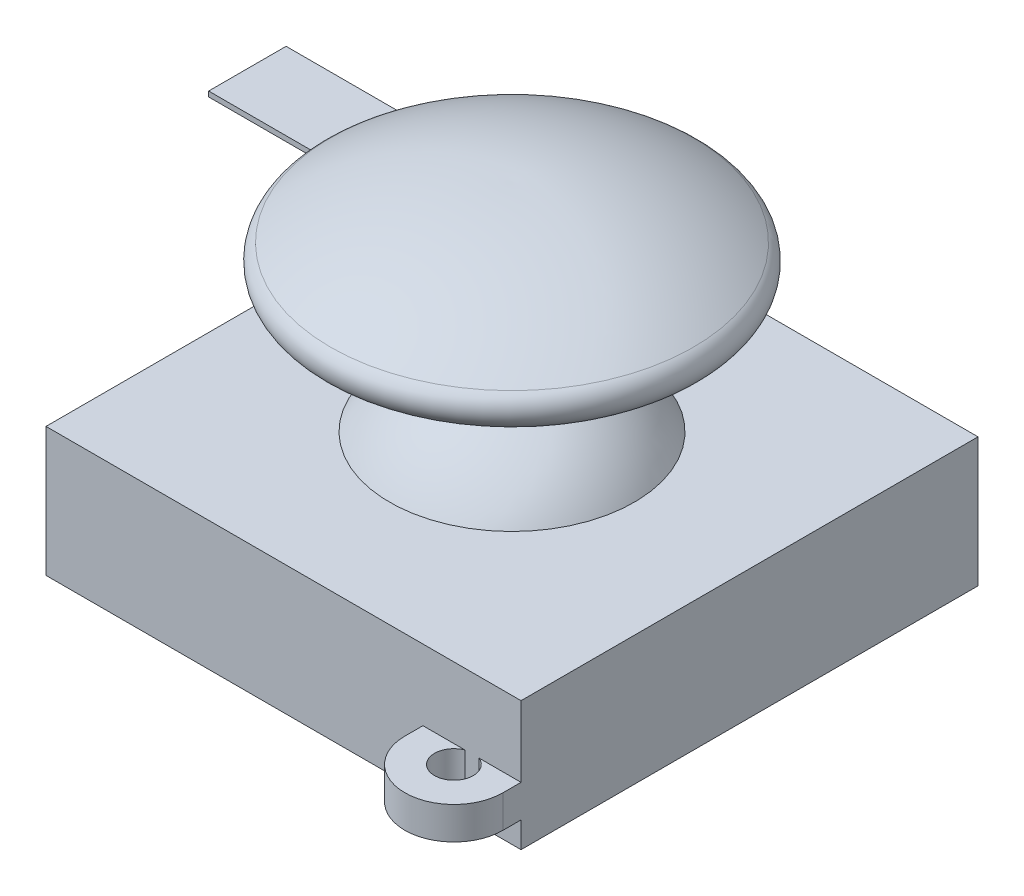
ISO-10303-21;
HEADER;
FILE_DESCRIPTION(('STEP AP214'),'2;1');
FILE_NAME('part.step','',(''),(''),'','','');
FILE_SCHEMA(('AUTOMOTIVE_DESIGN { 1 0 10303 214 1 1 1 1 }'));
ENDSEC;
DATA;
#1=APPLICATION_CONTEXT('core data for automotive mechanical design processes');
#2=APPLICATION_PROTOCOL_DEFINITION('international standard','automotive_design',2000,#1);
#3=PRODUCT_CONTEXT('',#1,'mechanical');
#4=PRODUCT('Part','Part','',(#3));
#5=PRODUCT_RELATED_PRODUCT_CATEGORY('part','',(#4));
#6=PRODUCT_DEFINITION_FORMATION('','',#4);
#7=PRODUCT_DEFINITION_CONTEXT('part definition',#1,'design');
#8=PRODUCT_DEFINITION('design','',#6,#7);
#9=PRODUCT_DEFINITION_SHAPE('','',#8);
#10=(LENGTH_UNIT() NAMED_UNIT(*) SI_UNIT(.MILLI.,.METRE.));
#11=(NAMED_UNIT(*) PLANE_ANGLE_UNIT() SI_UNIT($,.RADIAN.));
#12=(NAMED_UNIT(*) SI_UNIT($,.STERADIAN.) SOLID_ANGLE_UNIT());
#13=UNCERTAINTY_MEASURE_WITH_UNIT(LENGTH_MEASURE(1.E-05),#10,'distance_accuracy_value','');
#14=(GEOMETRIC_REPRESENTATION_CONTEXT(3) GLOBAL_UNCERTAINTY_ASSIGNED_CONTEXT((#13)) GLOBAL_UNIT_ASSIGNED_CONTEXT((#10,
#11,#12)) REPRESENTATION_CONTEXT('',''));
#15=CARTESIAN_POINT('',(0.,0.,0.));
#16=DIRECTION('',(0.,0.,1.));
#17=DIRECTION('',(1.,0.,0.));
#18=AXIS2_PLACEMENT_3D('',#15,#16,#17);
#19=CARTESIAN_POINT('',(-9.2,5.,8.85));
#20=DIRECTION('',(0.,0.,-1.));
#21=DIRECTION('',(-1.,0.,0.));
#22=AXIS2_PLACEMENT_3D('',#19,#20,#21);
#23=PLANE('',#22);
#24=DIRECTION('',(1.,0.,0.));
#25=VECTOR('',#24,1.);
#26=CARTESIAN_POINT('',(5.4,2.26,8.85));
#27=LINE('',#26,#25);
#28=CARTESIAN_POINT('',(5.4,2.26,8.85));
#29=VERTEX_POINT('',#28);
#30=CARTESIAN_POINT('',(7.03074175964328,2.26,8.85));
#31=VERTEX_POINT('',#30);
#32=EDGE_CURVE('E313',#29,#31,#27,.T.);
#33=ORIENTED_EDGE('',*,*,#32,.T.);
#34=DIRECTION('',(0.,-1.,0.));
#35=VECTOR('',#34,1.);
#36=CARTESIAN_POINT('',(7.03074175964328,2.26,8.85));
#37=LINE('',#36,#35);
#38=CARTESIAN_POINT('',(7.03074175964328,1.,8.85));
#39=VERTEX_POINT('',#38);
#40=EDGE_CURVE('E289',#31,#39,#37,.T.);
#41=ORIENTED_EDGE('',*,*,#40,.T.);
#42=DIRECTION('',(1.,0.,0.));
#43=VECTOR('',#42,1.);
#44=CARTESIAN_POINT('',(5.4,1.,8.85));
#45=LINE('',#44,#43);
#46=CARTESIAN_POINT('',(5.4,1.,8.85));
#47=VERTEX_POINT('',#46);
#48=EDGE_CURVE('E296',#47,#39,#45,.T.);
#49=ORIENTED_EDGE('',*,*,#48,.F.);
#50=DIRECTION('',(0.,-1.,0.));
#51=VECTOR('',#50,1.);
#52=CARTESIAN_POINT('',(5.4,2.26,8.85));
#53=LINE('',#52,#51);
#54=EDGE_CURVE('E286',#29,#47,#53,.T.);
#55=ORIENTED_EDGE('',*,*,#54,.F.);
#56=EDGE_LOOP('',(#33,#41,#49,#55));
#57=FACE_BOUND('',#56,.T.);
#58=DIRECTION('',(1.,0.,0.));
#59=VECTOR('',#58,1.);
#60=CARTESIAN_POINT('',(7.56925824035672,2.26,8.85));
#61=LINE('',#60,#59);
#62=CARTESIAN_POINT('',(7.56925824035672,2.26,8.85));
#63=VERTEX_POINT('',#62);
#64=CARTESIAN_POINT('',(9.2,2.26,8.85));
#65=VERTEX_POINT('',#64);
#66=EDGE_CURVE('E297',#63,#65,#61,.T.);
#67=ORIENTED_EDGE('',*,*,#66,.T.);
#68=DIRECTION('',(0.,-1.,0.));
#69=VECTOR('',#68,1.);
#70=CARTESIAN_POINT('',(9.2,5.,8.85));
#71=LINE('',#70,#69);
#72=CARTESIAN_POINT('',(9.2,5.,8.85));
#73=VERTEX_POINT('',#72);
#74=EDGE_CURVE('E382',#73,#65,#71,.T.);
#75=ORIENTED_EDGE('',*,*,#74,.F.);
#76=DIRECTION('',(1.,0.,0.));
#77=VECTOR('',#76,1.);
#78=CARTESIAN_POINT('',(-9.2,5.,8.85));
#79=LINE('',#78,#77);
#80=CARTESIAN_POINT('',(-9.2,5.,8.85));
#81=VERTEX_POINT('',#80);
#82=EDGE_CURVE('E370',#81,#73,#79,.T.);
#83=ORIENTED_EDGE('',*,*,#82,.F.);
#84=DIRECTION('',(0.,-1.,0.));
#85=VECTOR('',#84,1.);
#86=CARTESIAN_POINT('',(-9.2,5.,8.85));
#87=LINE('',#86,#85);
#88=CARTESIAN_POINT('',(-9.2,0.,8.85));
#89=VERTEX_POINT('',#88);
#90=EDGE_CURVE('E385',#81,#89,#87,.T.);
#91=ORIENTED_EDGE('',*,*,#90,.T.);
#92=DIRECTION('',(1.,0.,0.));
#93=VECTOR('',#92,1.);
#94=CARTESIAN_POINT('',(-9.2,0.,8.85));
#95=LINE('',#94,#93);
#96=CARTESIAN_POINT('',(9.2,0.,8.85));
#97=VERTEX_POINT('',#96);
#98=EDGE_CURVE('E366',#89,#97,#95,.T.);
#99=ORIENTED_EDGE('',*,*,#98,.T.);
#100=CARTESIAN_POINT('',(9.2,1.,8.85));
#101=VERTEX_POINT('',#100);
#102=EDGE_CURVE('E372',#101,#97,#71,.T.);
#103=ORIENTED_EDGE('',*,*,#102,.F.);
#104=DIRECTION('',(1.,0.,0.));
#105=VECTOR('',#104,1.);
#106=CARTESIAN_POINT('',(7.56925824035672,1.,8.85));
#107=LINE('',#106,#105);
#108=CARTESIAN_POINT('',(7.56925824035671,1.,8.85));
#109=VERTEX_POINT('',#108);
#110=EDGE_CURVE('E307',#109,#101,#107,.T.);
#111=ORIENTED_EDGE('',*,*,#110,.F.);
#112=DIRECTION('',(0.,-1.,0.));
#113=VECTOR('',#112,1.);
#114=CARTESIAN_POINT('',(7.56925824035672,2.26,8.85));
#115=LINE('',#114,#113);
#116=EDGE_CURVE('E279',#63,#109,#115,.T.);
#117=ORIENTED_EDGE('',*,*,#116,.F.);
#118=EDGE_LOOP('',(#67,#75,#83,#91,#99,#103,#111,#117));
#119=FACE_BOUND('',#118,.T.);
#120=ADVANCED_FACE('F45',(#57,#119),#23,.F.);
#121=CARTESIAN_POINT('',(-9.2,5.,8.85));
#122=DIRECTION('',(1.,0.,0.));
#123=DIRECTION('',(0.,0.,-1.));
#124=AXIS2_PLACEMENT_3D('',#121,#122,#123);
#125=PLANE('',#124);
#126=DIRECTION('',(0.,0.,1.));
#127=VECTOR('',#126,1.);
#128=CARTESIAN_POINT('',(-9.2,1.,-5.05));
#129=LINE('',#128,#127);
#130=CARTESIAN_POINT('',(-9.2,1.,-8.85));
#131=VERTEX_POINT('',#130);
#132=CARTESIAN_POINT('',(-9.2,1.,-5.05));
#133=VERTEX_POINT('',#132);
#134=EDGE_CURVE('E330',#131,#133,#129,.T.);
#135=ORIENTED_EDGE('',*,*,#134,.F.);
#136=DIRECTION('',(0.,-1.,0.));
#137=VECTOR('',#136,1.);
#138=CARTESIAN_POINT('',(-9.2,5.,-8.85));
#139=LINE('',#138,#137);
#140=CARTESIAN_POINT('',(-9.2,0.4,-8.85));
#141=VERTEX_POINT('',#140);
#142=EDGE_CURVE('E222',#131,#141,#139,.T.);
#143=ORIENTED_EDGE('',*,*,#142,.T.);
#144=DIRECTION('',(0.,0.,-1.));
#145=VECTOR('',#144,1.);
#146=CARTESIAN_POINT('',(-9.2,0.4,-8.85));
#147=LINE('',#146,#145);
#148=CARTESIAN_POINT('',(-9.2,0.4,-9.20749388800349));
#149=VERTEX_POINT('',#148);
#150=EDGE_CURVE('E213',#141,#149,#147,.T.);
#151=ORIENTED_EDGE('',*,*,#150,.T.);
#152=DIRECTION('',(0.,-1.,0.));
#153=VECTOR('',#152,1.);
#154=CARTESIAN_POINT('',(-9.2,0.4,-9.20749388800349));
#155=LINE('',#154,#153);
#156=CARTESIAN_POINT('',(-9.2,0.2,-9.20749388800349));
#157=VERTEX_POINT('',#156);
#158=EDGE_CURVE('E196',#149,#157,#155,.T.);
#159=ORIENTED_EDGE('',*,*,#158,.T.);
#160=DIRECTION('',(0.,0.,-1.));
#161=VECTOR('',#160,1.);
#162=CARTESIAN_POINT('',(-9.2,0.2,-8.85));
#163=LINE('',#162,#161);
#164=CARTESIAN_POINT('',(-9.2,0.2,-8.85));
#165=VERTEX_POINT('',#164);
#166=EDGE_CURVE('E241',#165,#157,#163,.T.);
#167=ORIENTED_EDGE('',*,*,#166,.F.);
#168=CARTESIAN_POINT('',(-9.2,0.,-8.85));
#169=VERTEX_POINT('',#168);
#170=EDGE_CURVE('E387',#165,#169,#139,.T.);
#171=ORIENTED_EDGE('',*,*,#170,.T.);
#172=DIRECTION('',(0.,0.,1.));
#173=VECTOR('',#172,1.);
#174=CARTESIAN_POINT('',(-9.2,0.,8.85));
#175=LINE('',#174,#173);
#176=EDGE_CURVE('E378',#169,#89,#175,.T.);
#177=ORIENTED_EDGE('',*,*,#176,.T.);
#178=ORIENTED_EDGE('',*,*,#90,.F.);
#179=DIRECTION('',(0.,0.,1.));
#180=VECTOR('',#179,1.);
#181=CARTESIAN_POINT('',(-9.2,5.,8.85));
#182=LINE('',#181,#180);
#183=CARTESIAN_POINT('',(-9.2,5.,-8.85));
#184=VERTEX_POINT('',#183);
#185=EDGE_CURVE('E368',#184,#81,#182,.T.);
#186=ORIENTED_EDGE('',*,*,#185,.F.);
#187=CARTESIAN_POINT('',(-9.2,2.26,-8.85));
#188=VERTEX_POINT('',#187);
#189=EDGE_CURVE('E388',#184,#188,#139,.T.);
#190=ORIENTED_EDGE('',*,*,#189,.T.);
#191=DIRECTION('',(0.,0.,1.));
#192=VECTOR('',#191,1.);
#193=CARTESIAN_POINT('',(-9.2,2.26,-5.05));
#194=LINE('',#193,#192);
#195=CARTESIAN_POINT('',(-9.2,2.26,-5.05));
#196=VERTEX_POINT('',#195);
#197=EDGE_CURVE('E333',#188,#196,#194,.T.);
#198=ORIENTED_EDGE('',*,*,#197,.T.);
#199=DIRECTION('',(0.,-1.,0.));
#200=VECTOR('',#199,1.);
#201=CARTESIAN_POINT('',(-9.2,2.26,-5.05));
#202=LINE('',#201,#200);
#203=EDGE_CURVE('E346',#196,#133,#202,.T.);
#204=ORIENTED_EDGE('',*,*,#203,.T.);
#205=EDGE_LOOP('',(#135,#143,#151,#159,#167,#171,#177,#178,#186,#190,#198,#204));
#206=FACE_BOUND('',#205,.T.);
#207=ADVANCED_FACE('F220',(#206),#125,.F.);
#208=CARTESIAN_POINT('',(9.2,5.,8.85));
#209=DIRECTION('',(-1.,0.,0.));
#210=DIRECTION('',(0.,0.,1.));
#211=AXIS2_PLACEMENT_3D('',#208,#209,#210);
#212=PLANE('',#211);
#213=DIRECTION('',(0.,0.,-1.));
#214=VECTOR('',#213,1.);
#215=CARTESIAN_POINT('',(9.2,0.,8.85));
#216=LINE('',#215,#214);
#217=CARTESIAN_POINT('',(9.2,0.,-8.85));
#218=VERTEX_POINT('',#217);
#219=EDGE_CURVE('E357',#97,#218,#216,.T.);
#220=ORIENTED_EDGE('',*,*,#219,.T.);
#221=DIRECTION('',(0.,-1.,0.));
#222=VECTOR('',#221,1.);
#223=CARTESIAN_POINT('',(9.2,5.,-8.85));
#224=LINE('',#223,#222);
#225=CARTESIAN_POINT('',(9.2,5.,-8.85));
#226=VERTEX_POINT('',#225);
#227=EDGE_CURVE('E49',#226,#218,#224,.T.);
#228=ORIENTED_EDGE('',*,*,#227,.F.);
#229=DIRECTION('',(0.,0.,-1.));
#230=VECTOR('',#229,1.);
#231=CARTESIAN_POINT('',(9.2,5.,8.85));
#232=LINE('',#231,#230);
#233=EDGE_CURVE('E362',#73,#226,#232,.T.);
#234=ORIENTED_EDGE('',*,*,#233,.F.);
#235=ORIENTED_EDGE('',*,*,#74,.T.);
#236=DIRECTION('',(0.,0.,1.));
#237=VECTOR('',#236,1.);
#238=CARTESIAN_POINT('',(9.2,2.26,8.85));
#239=LINE('',#238,#237);
#240=CARTESIAN_POINT('',(9.2,2.26,9.55));
#241=VERTEX_POINT('',#240);
#242=EDGE_CURVE('E322',#65,#241,#239,.T.);
#243=ORIENTED_EDGE('',*,*,#242,.T.);
#244=DIRECTION('',(0.,-1.,0.));
#245=VECTOR('',#244,1.);
#246=CARTESIAN_POINT('',(9.2,2.26,9.55));
#247=LINE('',#246,#245);
#248=CARTESIAN_POINT('',(9.2,1.,9.55));
#249=VERTEX_POINT('',#248);
#250=EDGE_CURVE('E281',#241,#249,#247,.T.);
#251=ORIENTED_EDGE('',*,*,#250,.T.);
#252=DIRECTION('',(0.,0.,1.));
#253=VECTOR('',#252,1.);
#254=CARTESIAN_POINT('',(9.2,1.,8.85));
#255=LINE('',#254,#253);
#256=EDGE_CURVE('E304',#101,#249,#255,.T.);
#257=ORIENTED_EDGE('',*,*,#256,.F.);
#258=ORIENTED_EDGE('',*,*,#102,.T.);
#259=EDGE_LOOP('',(#220,#228,#234,#235,#243,#251,#257,#258));
#260=FACE_BOUND('',#259,.T.);
#261=ADVANCED_FACE('F47',(#260),#212,.F.);
#262=CARTESIAN_POINT('',(-9.2,5.,-8.85));
#263=DIRECTION('',(0.,0.,1.));
#264=DIRECTION('',(1.,0.,0.));
#265=AXIS2_PLACEMENT_3D('',#262,#263,#264);
#266=PLANE('',#265);
#267=DIRECTION('',(0.,-1.,0.));
#268=VECTOR('',#267,1.);
#269=CARTESIAN_POINT('',(-6.2,0.4,-8.85));
#270=LINE('',#269,#268);
#271=CARTESIAN_POINT('',(-6.2,0.4,-8.85));
#272=VERTEX_POINT('',#271);
#273=CARTESIAN_POINT('',(-6.2,0.2,-8.85));
#274=VERTEX_POINT('',#273);
#275=EDGE_CURVE('E61',#272,#274,#270,.T.);
#276=ORIENTED_EDGE('',*,*,#275,.F.);
#277=DIRECTION('',(-1.,0.,0.));
#278=VECTOR('',#277,1.);
#279=CARTESIAN_POINT('',(-6.2,0.4,-8.85));
#280=LINE('',#279,#278);
#281=EDGE_CURVE('E223',#272,#141,#280,.T.);
#282=ORIENTED_EDGE('',*,*,#281,.T.);
#283=ORIENTED_EDGE('',*,*,#142,.F.);
#284=DIRECTION('',(1.,0.,0.));
#285=VECTOR('',#284,1.);
#286=CARTESIAN_POINT('',(-9.2,1.,-8.85));
#287=LINE('',#286,#285);
#288=CARTESIAN_POINT('',(-10.9,1.,-8.85));
#289=VERTEX_POINT('',#288);
#290=EDGE_CURVE('E337',#289,#131,#287,.T.);
#291=ORIENTED_EDGE('',*,*,#290,.F.);
#292=DIRECTION('',(0.,-1.,0.));
#293=VECTOR('',#292,1.);
#294=CARTESIAN_POINT('',(-10.9,2.26,-8.85));
#295=LINE('',#294,#293);
#296=CARTESIAN_POINT('',(-10.9,2.26,-8.85));
#297=VERTEX_POINT('',#296);
#298=EDGE_CURVE('E355',#297,#289,#295,.T.);
#299=ORIENTED_EDGE('',*,*,#298,.F.);
#300=DIRECTION('',(1.,0.,0.));
#301=VECTOR('',#300,1.);
#302=CARTESIAN_POINT('',(-9.2,2.26,-8.85));
#303=LINE('',#302,#301);
#304=EDGE_CURVE('E343',#297,#188,#303,.T.);
#305=ORIENTED_EDGE('',*,*,#304,.T.);
#306=ORIENTED_EDGE('',*,*,#189,.F.);
#307=DIRECTION('',(-1.,0.,0.));
#308=VECTOR('',#307,1.);
#309=CARTESIAN_POINT('',(-9.2,5.,-8.85));
#310=LINE('',#309,#308);
#311=EDGE_CURVE('E365',#226,#184,#310,.T.);
#312=ORIENTED_EDGE('',*,*,#311,.F.);
#313=ORIENTED_EDGE('',*,*,#227,.T.);
#314=DIRECTION('',(-1.,0.,0.));
#315=VECTOR('',#314,1.);
#316=CARTESIAN_POINT('',(-9.2,0.,-8.85));
#317=LINE('',#316,#315);
#318=EDGE_CURVE('E375',#218,#169,#317,.T.);
#319=ORIENTED_EDGE('',*,*,#318,.T.);
#320=ORIENTED_EDGE('',*,*,#170,.F.);
#321=DIRECTION('',(-1.,0.,0.));
#322=VECTOR('',#321,1.);
#323=CARTESIAN_POINT('',(-6.2,0.2,-8.85));
#324=LINE('',#323,#322);
#325=EDGE_CURVE('E66',#274,#165,#324,.T.);
#326=ORIENTED_EDGE('',*,*,#325,.F.);
#327=EDGE_LOOP('',(#276,#282,#283,#291,#299,#305,#306,#312,#313,#319,#320,#326));
#328=FACE_BOUND('',#327,.T.);
#329=ADVANCED_FACE('F395',(#328),#266,.F.);
#330=CARTESIAN_POINT('',(0.,5.,0.));
#331=DIRECTION('',(0.,-1.,0.));
#332=DIRECTION('',(0.,0.,-1.));
#333=AXIS2_PLACEMENT_3D('',#330,#331,#332);
#334=PLANE('',#333);
#335=CARTESIAN_POINT('',(0.,5.,0.));
#336=DIRECTION('',(0.,1.,0.));
#337=DIRECTION('',(0.,0.,1.));
#338=AXIS2_PLACEMENT_3D('',#335,#336,#337);
#339=CIRCLE('',#338,4.74);
#340=CARTESIAN_POINT('',(0.,5.,-4.74));
#341=VERTEX_POINT('',#340);
#342=EDGE_CURVE('E11',#341,#341,#339,.T.);
#343=ORIENTED_EDGE('',*,*,#342,.F.);
#344=EDGE_LOOP('',(#343));
#345=FACE_BOUND('',#344,.T.);
#346=ORIENTED_EDGE('',*,*,#233,.T.);
#347=ORIENTED_EDGE('',*,*,#311,.T.);
#348=ORIENTED_EDGE('',*,*,#185,.T.);
#349=ORIENTED_EDGE('',*,*,#82,.T.);
#350=EDGE_LOOP('',(#346,#347,#348,#349));
#351=FACE_BOUND('',#350,.T.);
#352=ADVANCED_FACE('F407',(#345,#351),#334,.F.);
#353=CARTESIAN_POINT('',(0.,0.,0.));
#354=DIRECTION('',(0.,-1.,0.));
#355=DIRECTION('',(0.,0.,-1.));
#356=AXIS2_PLACEMENT_3D('',#353,#354,#355);
#357=PLANE('',#356);
#358=ORIENTED_EDGE('',*,*,#219,.F.);
#359=ORIENTED_EDGE('',*,*,#98,.F.);
#360=ORIENTED_EDGE('',*,*,#176,.F.);
#361=ORIENTED_EDGE('',*,*,#318,.F.);
#362=EDGE_LOOP('',(#358,#359,#360,#361));
#363=FACE_BOUND('',#362,.T.);
#364=ADVANCED_FACE('F400',(#363),#357,.T.);
#365=CARTESIAN_POINT('',(-10.9,2.26,-6.95));
#366=DIRECTION('',(0.,-1.,0.));
#367=DIRECTION('',(0.,0.,-1.));
#368=AXIS2_PLACEMENT_3D('',#365,#366,#367);
#369=CYLINDRICAL_SURFACE('',#368,1.9);
#370=CARTESIAN_POINT('',(-10.9,1.,-6.95));
#371=DIRECTION('',(0.,-1.,0.));
#372=DIRECTION('',(0.,0.,1.));
#373=AXIS2_PLACEMENT_3D('',#370,#371,#372);
#374=CIRCLE('',#373,1.9);
#375=CARTESIAN_POINT('',(-10.9,1.,-5.05));
#376=VERTEX_POINT('',#375);
#377=EDGE_CURVE('E351',#376,#289,#374,.T.);
#378=ORIENTED_EDGE('',*,*,#377,.F.);
#379=DIRECTION('',(0.,-1.,0.));
#380=VECTOR('',#379,1.);
#381=CARTESIAN_POINT('',(-10.9,2.26,-5.05));
#382=LINE('',#381,#380);
#383=CARTESIAN_POINT('',(-10.9,2.26,-5.05));
#384=VERTEX_POINT('',#383);
#385=EDGE_CURVE('E358',#384,#376,#382,.T.);
#386=ORIENTED_EDGE('',*,*,#385,.F.);
#387=CARTESIAN_POINT('',(-10.9,2.26,-6.95));
#388=DIRECTION('',(0.,-1.,0.));
#389=DIRECTION('',(0.,0.,1.));
#390=AXIS2_PLACEMENT_3D('',#387,#388,#389);
#391=CIRCLE('',#390,1.9);
#392=EDGE_CURVE('E340',#384,#297,#391,.T.);
#393=ORIENTED_EDGE('',*,*,#392,.T.);
#394=ORIENTED_EDGE('',*,*,#298,.T.);
#395=EDGE_LOOP('',(#378,#386,#393,#394));
#396=FACE_BOUND('',#395,.T.);
#397=ADVANCED_FACE('F514',(#396),#369,.T.);
#398=CARTESIAN_POINT('',(-10.9,2.26,-5.05));
#399=DIRECTION('',(0.,0.,1.));
#400=DIRECTION('',(1.,0.,0.));
#401=AXIS2_PLACEMENT_3D('',#398,#399,#400);
#402=PLANE('',#401);
#403=DIRECTION('',(-1.,0.,0.));
#404=VECTOR('',#403,1.);
#405=CARTESIAN_POINT('',(-10.9,1.,-5.05));
#406=LINE('',#405,#404);
#407=EDGE_CURVE('E348',#133,#376,#406,.T.);
#408=ORIENTED_EDGE('',*,*,#407,.F.);
#409=ORIENTED_EDGE('',*,*,#203,.F.);
#410=DIRECTION('',(-1.,0.,0.));
#411=VECTOR('',#410,1.);
#412=CARTESIAN_POINT('',(-10.9,2.26,-5.05));
#413=LINE('',#412,#411);
#414=EDGE_CURVE('E336',#196,#384,#413,.T.);
#415=ORIENTED_EDGE('',*,*,#414,.T.);
#416=ORIENTED_EDGE('',*,*,#385,.T.);
#417=EDGE_LOOP('',(#408,#409,#415,#416));
#418=FACE_BOUND('',#417,.T.);
#419=ADVANCED_FACE('F417',(#418),#402,.T.);
#420=CARTESIAN_POINT('',(-10.9,2.26,-6.95));
#421=DIRECTION('',(0.,1.,0.));
#422=DIRECTION('',(0.,0.,1.));
#423=AXIS2_PLACEMENT_3D('',#420,#421,#422);
#424=PLANE('',#423);
#425=CARTESIAN_POINT('',(-10.9,2.26,-6.95));
#426=DIRECTION('',(0.,-1.,0.));
#427=DIRECTION('',(0.,0.,-1.));
#428=AXIS2_PLACEMENT_3D('',#425,#426,#427);
#429=CIRCLE('',#428,0.9);
#430=CARTESIAN_POINT('',(-10.9,2.26,-7.85));
#431=VERTEX_POINT('',#430);
#432=EDGE_CURVE('E327',#431,#431,#429,.T.);
#433=ORIENTED_EDGE('',*,*,#432,.T.);
#434=EDGE_LOOP('',(#433));
#435=FACE_BOUND('',#434,.T.);
#436=ORIENTED_EDGE('',*,*,#197,.F.);
#437=ORIENTED_EDGE('',*,*,#304,.F.);
#438=ORIENTED_EDGE('',*,*,#392,.F.);
#439=ORIENTED_EDGE('',*,*,#414,.F.);
#440=EDGE_LOOP('',(#436,#437,#438,#439));
#441=FACE_BOUND('',#440,.T.);
#442=ADVANCED_FACE('F413',(#435,#441),#424,.T.);
#443=CARTESIAN_POINT('',(-10.9,1.,-6.95));
#444=DIRECTION('',(0.,1.,0.));
#445=DIRECTION('',(0.,0.,1.));
#446=AXIS2_PLACEMENT_3D('',#443,#444,#445);
#447=PLANE('',#446);
#448=CARTESIAN_POINT('',(-10.9,1.,-6.95));
#449=DIRECTION('',(0.,-1.,0.));
#450=DIRECTION('',(0.,0.,-1.));
#451=AXIS2_PLACEMENT_3D('',#448,#449,#450);
#452=CIRCLE('',#451,0.9);
#453=CARTESIAN_POINT('',(-10.9,1.,-7.85));
#454=VERTEX_POINT('',#453);
#455=EDGE_CURVE('E310',#454,#454,#452,.T.);
#456=ORIENTED_EDGE('',*,*,#455,.F.);
#457=EDGE_LOOP('',(#456));
#458=FACE_BOUND('',#457,.T.);
#459=ORIENTED_EDGE('',*,*,#134,.T.);
#460=ORIENTED_EDGE('',*,*,#407,.T.);
#461=ORIENTED_EDGE('',*,*,#377,.T.);
#462=ORIENTED_EDGE('',*,*,#290,.T.);
#463=EDGE_LOOP('',(#459,#460,#461,#462));
#464=FACE_BOUND('',#463,.T.);
#465=ADVANCED_FACE('F420',(#458,#464),#447,.F.);
#466=CARTESIAN_POINT('',(-10.9,2.26,-6.95));
#467=DIRECTION('',(0.,-1.,0.));
#468=DIRECTION('',(0.,0.,-1.));
#469=AXIS2_PLACEMENT_3D('',#466,#467,#468);
#470=CYLINDRICAL_SURFACE('',#469,0.9);
#471=ORIENTED_EDGE('',*,*,#432,.F.);
#472=EDGE_LOOP('',(#471));
#473=FACE_BOUND('',#472,.T.);
#474=ORIENTED_EDGE('',*,*,#455,.T.);
#475=EDGE_LOOP('',(#474));
#476=FACE_BOUND('',#475,.T.);
#477=ADVANCED_FACE('F502',(#473,#476),#470,.F.);
#478=CARTESIAN_POINT('',(7.3,2.26,9.55));
#479=DIRECTION('',(0.,-1.,0.));
#480=DIRECTION('',(0.,0.,-1.));
#481=AXIS2_PLACEMENT_3D('',#478,#479,#480);
#482=CYLINDRICAL_SURFACE('',#481,0.749999999999999);
#483=CARTESIAN_POINT('',(7.3,1.,9.55));
#484=DIRECTION('',(0.,1.,0.));
#485=DIRECTION('',(0.,0.,-1.));
#486=AXIS2_PLACEMENT_3D('',#483,#484,#485);
#487=CIRCLE('',#486,0.749999999999999);
#488=EDGE_CURVE('E294',#39,#109,#487,.T.);
#489=ORIENTED_EDGE('',*,*,#488,.F.);
#490=ORIENTED_EDGE('',*,*,#40,.F.);
#491=CARTESIAN_POINT('',(7.3,2.26,9.55));
#492=DIRECTION('',(0.,1.,0.));
#493=DIRECTION('',(0.,0.,-1.));
#494=AXIS2_PLACEMENT_3D('',#491,#492,#493);
#495=CIRCLE('',#494,0.749999999999999);
#496=EDGE_CURVE('E283',#31,#63,#495,.T.);
#497=ORIENTED_EDGE('',*,*,#496,.T.);
#498=ORIENTED_EDGE('',*,*,#116,.T.);
#499=EDGE_LOOP('',(#489,#490,#497,#498));
#500=FACE_BOUND('',#499,.T.);
#501=ADVANCED_FACE('F475',(#500),#482,.F.);
#502=CARTESIAN_POINT('',(5.4,2.26,9.55));
#503=DIRECTION('',(-1.,0.,0.));
#504=DIRECTION('',(0.,0.,1.));
#505=AXIS2_PLACEMENT_3D('',#502,#503,#504);
#506=PLANE('',#505);
#507=DIRECTION('',(0.,0.,-1.));
#508=VECTOR('',#507,1.);
#509=CARTESIAN_POINT('',(5.4,1.,9.55));
#510=LINE('',#509,#508);
#511=CARTESIAN_POINT('',(5.4,1.,9.55));
#512=VERTEX_POINT('',#511);
#513=EDGE_CURVE('E299',#512,#47,#510,.T.);
#514=ORIENTED_EDGE('',*,*,#513,.F.);
#515=DIRECTION('',(0.,-1.,0.));
#516=VECTOR('',#515,1.);
#517=CARTESIAN_POINT('',(5.4,2.26,9.55));
#518=LINE('',#517,#516);
#519=CARTESIAN_POINT('',(5.4,2.26,9.55));
#520=VERTEX_POINT('',#519);
#521=EDGE_CURVE('E284',#520,#512,#518,.T.);
#522=ORIENTED_EDGE('',*,*,#521,.F.);
#523=DIRECTION('',(0.,0.,-1.));
#524=VECTOR('',#523,1.);
#525=CARTESIAN_POINT('',(5.4,2.26,9.55));
#526=LINE('',#525,#524);
#527=EDGE_CURVE('E316',#520,#29,#526,.T.);
#528=ORIENTED_EDGE('',*,*,#527,.T.);
#529=ORIENTED_EDGE('',*,*,#54,.T.);
#530=EDGE_LOOP('',(#514,#522,#528,#529));
#531=FACE_BOUND('',#530,.T.);
#532=ADVANCED_FACE('F484',(#531),#506,.T.);
#533=CARTESIAN_POINT('',(7.3,2.26,9.55));
#534=DIRECTION('',(0.,-1.,0.));
#535=DIRECTION('',(0.,0.,-1.));
#536=AXIS2_PLACEMENT_3D('',#533,#534,#535);
#537=CYLINDRICAL_SURFACE('',#536,1.9);
#538=CARTESIAN_POINT('',(7.3,1.,9.55));
#539=DIRECTION('',(0.,-1.,0.));
#540=DIRECTION('',(0.,0.,-1.));
#541=AXIS2_PLACEMENT_3D('',#538,#539,#540);
#542=CIRCLE('',#541,1.9);
#543=EDGE_CURVE('E301',#249,#512,#542,.T.);
#544=ORIENTED_EDGE('',*,*,#543,.F.);
#545=ORIENTED_EDGE('',*,*,#250,.F.);
#546=CARTESIAN_POINT('',(7.3,2.26,9.55));
#547=DIRECTION('',(0.,-1.,0.));
#548=DIRECTION('',(0.,0.,-1.));
#549=AXIS2_PLACEMENT_3D('',#546,#547,#548);
#550=CIRCLE('',#549,1.9);
#551=EDGE_CURVE('E319',#241,#520,#550,.T.);
#552=ORIENTED_EDGE('',*,*,#551,.T.);
#553=ORIENTED_EDGE('',*,*,#521,.T.);
#554=EDGE_LOOP('',(#544,#545,#552,#553));
#555=FACE_BOUND('',#554,.T.);
#556=ADVANCED_FACE('F487',(#555),#537,.T.);
#557=CARTESIAN_POINT('',(7.3,2.26,9.55));
#558=DIRECTION('',(0.,-1.,0.));
#559=DIRECTION('',(0.,0.,-1.));
#560=AXIS2_PLACEMENT_3D('',#557,#558,#559);
#561=PLANE('',#560);
#562=ORIENTED_EDGE('',*,*,#66,.F.);
#563=ORIENTED_EDGE('',*,*,#496,.F.);
#564=ORIENTED_EDGE('',*,*,#32,.F.);
#565=ORIENTED_EDGE('',*,*,#527,.F.);
#566=ORIENTED_EDGE('',*,*,#551,.F.);
#567=ORIENTED_EDGE('',*,*,#242,.F.);
#568=EDGE_LOOP('',(#562,#563,#564,#565,#566,#567));
#569=FACE_BOUND('',#568,.T.);
#570=ADVANCED_FACE('F478',(#569),#561,.F.);
#571=CARTESIAN_POINT('',(7.3,1.,9.55));
#572=DIRECTION('',(0.,-1.,0.));
#573=DIRECTION('',(0.,0.,-1.));
#574=AXIS2_PLACEMENT_3D('',#571,#572,#573);
#575=PLANE('',#574);
#576=ORIENTED_EDGE('',*,*,#110,.T.);
#577=ORIENTED_EDGE('',*,*,#256,.T.);
#578=ORIENTED_EDGE('',*,*,#543,.T.);
#579=ORIENTED_EDGE('',*,*,#513,.T.);
#580=ORIENTED_EDGE('',*,*,#48,.T.);
#581=ORIENTED_EDGE('',*,*,#488,.T.);
#582=EDGE_LOOP('',(#576,#577,#578,#579,#580,#581));
#583=FACE_BOUND('',#582,.T.);
#584=ADVANCED_FACE('F471',(#583),#575,.T.);
#585=CARTESIAN_POINT('',(0.,1.37813129650979,0.294572017765253));
#586=DIRECTION('',(-1.,0.,0.));
#587=DIRECTION('',(0.,0.,1.));
#588=AXIS2_PLACEMENT_3D('',#585,#586,#587);
#589=CIRCLE('',#588,12.0254771130965);
#590=TRIMMED_CURVE('',#589,(PARAMETER_VALUE(-1.59529443876098)),
(PARAMETER_VALUE(1.59529443876098)),.T.,.PARAMETER.);
#591=CARTESIAN_POINT('',(0.,1.37813129650979,0.));
#592=DIRECTION('',(0.,1.,0.));
#593=AXIS1_PLACEMENT('',#591,#592);
#594=SURFACE_OF_REVOLUTION('',#590,#593);
#595=CARTESIAN_POINT('',(0.,13.4,0.));
#596=VERTEX_POINT('',#595);
#597=VERTEX_LOOP('',#596);
#598=FACE_BOUND('',#597,.T.);
#599=CARTESIAN_POINT('',(0.,11.3424973198956,0.));
#600=DIRECTION('',(0.,1.,0.));
#601=DIRECTION('',(0.,0.,1.));
#602=AXIS2_PLACEMENT_3D('',#599,#600,#601);
#603=CIRCLE('',#602,7.02684574583086);
#604=CARTESIAN_POINT('',(0.,11.3424973198956,7.02684574583086));
#605=VERTEX_POINT('',#604);
#606=EDGE_CURVE('E259',#605,#605,#603,.T.);
#607=ORIENTED_EDGE('',*,*,#606,.T.);
#608=EDGE_LOOP('',(#607));
#609=FACE_BOUND('',#608,.T.);
#610=ADVANCED_FACE('F497',(#598,#609),#594,.T.);
#611=CARTESIAN_POINT('',(0.,1.99117057261873,0.));
#612=DIRECTION('',(0.,1.,0.));
#613=DIRECTION('',(0.,0.,-1.));
#614=AXIS2_PLACEMENT_3D('',#611,#612,#613);
#615=SPHERICAL_SURFACE('',#614,5.61432582979253);
#616=CARTESIAN_POINT('',(0.,7.29193981142507,0.));
#617=DIRECTION('',(0.,1.,0.));
#618=DIRECTION('',(0.,0.,1.));
#619=AXIS2_PLACEMENT_3D('',#616,#617,#618);
#620=CIRCLE('',#619,1.85);
#621=CARTESIAN_POINT('',(0.,7.29193981142507,-1.85));
#622=VERTEX_POINT('',#621);
#623=EDGE_CURVE('E277',#622,#622,#620,.T.);
#624=CARTESIAN_POINT('',(0.,7.29193981142507,-1.85));
#625=CARTESIAN_POINT('',(0.,7.27903977752609,-1.88696241301441));
#626=CARTESIAN_POINT('',(0.,7.26575301563685,-1.92378985319013));
#627=CARTESIAN_POINT('',(0.,7.23841211488858,-1.99715877117628));
#628=CARTESIAN_POINT('',(0.,7.22435797602955,-2.0337002489867));
#629=CARTESIAN_POINT('',(0.,7.19548840035243,-2.10648122555434));
#630=CARTESIAN_POINT('',(0.,7.18067296353435,-2.14272072431155));
#631=CARTESIAN_POINT('',(0.,7.15028729406418,-2.21488189175811));
#632=CARTESIAN_POINT('',(0.,7.1347170614121,-2.25080356044745));
#633=CARTESIAN_POINT('',(0.,7.10282860858213,-2.3223133468391));
#634=CARTESIAN_POINT('',(0.,7.08651038840425,-2.3579014645414));
#635=CARTESIAN_POINT('',(0.,7.05313310260394,-2.42872857640624));
#636=CARTESIAN_POINT('',(0.,7.03607403698153,-2.46396757056878));
#637=CARTESIAN_POINT('',(0.,7.00122252483024,-2.53408101492985));
#638=CARTESIAN_POINT('',(0.,6.98343007830137,-2.56895546512839));
#639=CARTESIAN_POINT('',(0.,6.94711959026037,-2.63832456083143));
#640=CARTESIAN_POINT('',(0.,6.92860154874825,-2.67281920633594));
#641=CARTESIAN_POINT('',(0.,6.89084797405393,-2.74141359807394));
#642=CARTESIAN_POINT('',(0.,6.87161244087175,-2.77551334430743));
#643=CARTESIAN_POINT('',(0.,6.83243230015215,-2.84330301574342));
#644=CARTESIAN_POINT('',(0.,6.81248769261473,-2.87699294094592));
#645=CARTESIAN_POINT('',(0.,6.77189813077556,-2.94394822789086));
#646=CARTESIAN_POINT('',(0.,6.7512531764738,-2.97721358963331));
#647=CARTESIAN_POINT('',(0.,6.70927195516508,-3.04330519301538));
#648=CARTESIAN_POINT('',(0.,6.68793568815812,-3.07613143465501));
#649=CARTESIAN_POINT('',(0.,6.64458117801013,-3.14133043334372));
#650=CARTESIAN_POINT('',(0.,6.62256293486911,-3.1737031903928));
#651=CARTESIAN_POINT('',(0.,6.57785410745132,-3.2379810538538));
#652=CARTESIAN_POINT('',(0.,6.55516352317456,-3.26988616026571));
#653=CARTESIAN_POINT('',(0.,6.50911994269444,-3.33321476104572));
#654=CARTESIAN_POINT('',(0.,6.48576694649107,-3.36463825541382));
#655=CARTESIAN_POINT('',(0.,6.43840876123278,-3.42698988144894));
#656=CARTESIAN_POINT('',(0.,6.41440357217784,-3.45791801311597));
#657=CARTESIAN_POINT('',(0.,6.36575150568554,-3.51926537985825));
#658=CARTESIAN_POINT('',(0.,6.34110462824818,-3.54968461493351));
#659=CARTESIAN_POINT('',(0.,6.29117997025763,-3.61000087729043));
#660=CARTESIAN_POINT('',(0.,6.26590218970444,-3.6398979045721));
#661=CARTESIAN_POINT('',(0.,6.21472678682672,-3.69915666865377));
#662=CARTESIAN_POINT('',(0.,6.18882916450219,-3.72851840545376));
#663=CARTESIAN_POINT('',(0.,6.13642541066387,-3.78669374012264));
#664=CARTESIAN_POINT('',(0.,6.10991927915007,-3.81550733799151));
#665=CARTESIAN_POINT('',(0.,6.05631010579373,-3.87257378620965));
#666=CARTESIAN_POINT('',(0.,6.0292070639512,-3.90082663655891));
#667=CARTESIAN_POINT('',(0.,5.974415930001,-3.95675922652788));
#668=CARTESIAN_POINT('',(0.,5.94672783789333,-3.98443896614758));
#669=CARTESIAN_POINT('',(0.,5.89077871948915,-4.03921322223537));
#670=CARTESIAN_POINT('',(0.,5.86251769319264,-4.06630773870346));
#671=CARTESIAN_POINT('',(0.,5.80543507319967,-4.1198996921568));
#672=CARTESIAN_POINT('',(0.,5.77661347950321,-4.14639712914206));
#673=CARTESIAN_POINT('',(0.,5.71842233679357,-4.19878332856759));
#674=CARTESIAN_POINT('',(0.,5.68905278778038,-4.22467209100786));
#675=CARTESIAN_POINT('',(0.,5.62977858632081,-4.2758296126617));
#676=CARTESIAN_POINT('',(0.,5.59987393387443,-4.30109837187528));
#677=CARTESIAN_POINT('',(0.,5.53954261151535,-4.35100482959179));
#678=CARTESIAN_POINT('',(0.,5.50911594160266,-4.37564252809472));
#679=CARTESIAN_POINT('',(0.,5.44775389898227,-4.42427608346509));
#680=CARTESIAN_POINT('',(0.,5.41681852627457,-4.44827194033254));
#681=CARTESIAN_POINT('',(0.,5.35445261431716,-4.49561131083309));
#682=CARTESIAN_POINT('',(0.,5.32302207506745,-4.51895482446619));
#683=CARTESIAN_POINT('',(0.,5.25967958677529,-4.56497929810097));
#684=CARTESIAN_POINT('',(0.,5.22776763773285,-4.58766025810264));
#685=CARTESIAN_POINT('',(0.,5.16347628302549,-4.63234968257653));
#686=CARTESIAN_POINT('',(0.,5.13109687736056,-4.65435814704875));
#687=CARTESIAN_POINT('',(0.,5.06588482027769,-4.6976930128176));
#688=CARTESIAN_POINT('',(0.,5.03305216885974,-4.71901941411423));
#689=CARTESIAN_POINT('',(0.,5.,-4.74));
#690=B_SPLINE_CURVE_WITH_KNOTS('',3,(#624,#625,#626,#627,#628,#629,#630,#631,#632,#633,#634,
#635,#636,#637,#638,#639,#640,#641,#642,#643,#644,#645,#646,#647,#648,#649,#650,#651,#652,#653,
#654,#655,#656,#657,#658,#659,#660,#661,#662,#663,#664,#665,#666,#667,#668,#669,#670,#671,#672,
#673,#674,#675,#676,#677,#678,#679,#680,#681,#682,#683,#684,#685,#686,#687,#688,#689),
.UNSPECIFIED.,.F.,.F.,(4,2,2,2,2,2,2,2,2,2,2,2,2,2,2,2,2,2,2,2,2,2,2,2,2,2,2,2,2,2,2,2,4),(0.,
0.117444343090669,0.234888686181339,0.352333029272007,0.469777372362676,0.587221715453346,
0.704666058544015,0.822110401634684,0.939554744725353,1.05699908781602,1.17444343090669,
1.29188777399736,1.40933211708803,1.5267764601787,1.64422080326937,1.76166514636004,
1.87910948945071,1.99655383254138,2.11399817563205,2.23144251872272,2.34888686181338,
2.46633120490405,2.58377554799472,2.70121989108539,2.81866423417606,2.93610857726673,
3.0535529203574,3.17099726344807,3.28844160653874,3.40588594962941,3.52333029272008,
3.64077463581075,3.75821897890141),.UNSPECIFIED.);
#691=EDGE_CURVE('BSEAM574',#622,#341,#690,.T.);
#692=ORIENTED_EDGE('',*,*,#623,.F.);
#693=ORIENTED_EDGE('',*,*,#342,.T.);
#694=ORIENTED_EDGE('',*,*,#691,.T.);
#695=ORIENTED_EDGE('',*,*,#691,.F.);
#696=EDGE_LOOP('',(#692,#694,#693,#695));
#697=FACE_BOUND('',#696,.T.);
#698=ADVANCED_FACE('F574',(#697),#615,.T.);
#699=CARTESIAN_POINT('',(0.,13.4,0.));
#700=DIRECTION('',(0.,1.,0.));
#701=DIRECTION('',(0.,0.,1.));
#702=AXIS2_PLACEMENT_3D('',#699,#700,#701);
#703=CYLINDRICAL_SURFACE('',#702,1.85);
#704=CARTESIAN_POINT('',(0.,10.,0.));
#705=DIRECTION('',(0.,1.,0.));
#706=DIRECTION('',(0.,0.,1.));
#707=AXIS2_PLACEMENT_3D('',#704,#705,#706);
#708=CIRCLE('',#707,1.85);
#709=CARTESIAN_POINT('',(0.,10.,1.85));
#710=VERTEX_POINT('',#709);
#711=EDGE_CURVE('E274',#710,#710,#708,.T.);
#712=ORIENTED_EDGE('',*,*,#711,.F.);
#713=EDGE_LOOP('',(#712));
#714=FACE_BOUND('',#713,.T.);
#715=ORIENTED_EDGE('',*,*,#623,.T.);
#716=EDGE_LOOP('',(#715));
#717=FACE_BOUND('',#716,.T.);
#718=ADVANCED_FACE('F585',(#714,#717),#703,.T.);
#719=CARTESIAN_POINT('',(0.,10.,-6.61583510875465));
#720=DIRECTION('',(0.,1.,0.));
#721=DIRECTION('',(0.,0.,1.));
#722=AXIS2_PLACEMENT_3D('',#719,#720,#721);
#723=PLANE('',#722);
#724=CARTESIAN_POINT('',(0.,10.,0.));
#725=DIRECTION('',(0.,1.,0.));
#726=DIRECTION('',(0.,0.,1.));
#727=AXIS2_PLACEMENT_3D('',#724,#725,#726);
#728=CIRCLE('',#727,6.61583510875465);
#729=CARTESIAN_POINT('',(0.,10.,6.61583510875465));
#730=VERTEX_POINT('',#729);
#731=EDGE_CURVE('E271',#730,#730,#728,.T.);
#732=ORIENTED_EDGE('',*,*,#731,.F.);
#733=EDGE_LOOP('',(#732));
#734=FACE_BOUND('',#733,.T.);
#735=ORIENTED_EDGE('',*,*,#711,.T.);
#736=EDGE_LOOP('',(#735));
#737=FACE_BOUND('',#736,.T.);
#738=ADVANCED_FACE('F596',(#734,#737),#723,.F.);
#739=CARTESIAN_POINT('',(0.,10.7341648912453,0.));
#740=DIRECTION('',(0.,1.,0.));
#741=DIRECTION('',(0.,0.,1.));
#742=AXIS2_PLACEMENT_3D('',#739,#740,#741);
#743=TOROIDAL_SURFACE('',#742,6.61583510875465,0.734164891245347);
#744=ORIENTED_EDGE('',*,*,#606,.F.);
#745=EDGE_LOOP('',(#744));
#746=FACE_BOUND('',#745,.T.);
#747=ORIENTED_EDGE('',*,*,#731,.T.);
#748=EDGE_LOOP('',(#747));
#749=FACE_BOUND('',#748,.T.);
#750=ADVANCED_FACE('F608',(#746,#749),#743,.T.);
#751=CARTESIAN_POINT('',(-6.2,0.4,-9.3));
#752=DIRECTION('',(1.,0.,0.));
#753=DIRECTION('',(0.,0.,-1.));
#754=AXIS2_PLACEMENT_3D('',#751,#752,#753);
#755=PLANE('',#754);
#756=DIRECTION('',(0.,0.,1.));
#757=VECTOR('',#756,1.);
#758=CARTESIAN_POINT('',(-6.2,0.2,-9.3));
#759=LINE('',#758,#757);
#760=CARTESIAN_POINT('',(-6.2,0.2,-9.3));
#761=VERTEX_POINT('',#760);
#762=EDGE_CURVE('E225',#761,#274,#759,.T.);
#763=ORIENTED_EDGE('',*,*,#762,.F.);
#764=DIRECTION('',(0.,-1.,0.));
#765=VECTOR('',#764,1.);
#766=CARTESIAN_POINT('',(-6.2,0.4,-9.3));
#767=LINE('',#766,#765);
#768=CARTESIAN_POINT('',(-6.2,0.4,-9.3));
#769=VERTEX_POINT('',#768);
#770=EDGE_CURVE('E260',#769,#761,#767,.T.);
#771=ORIENTED_EDGE('',*,*,#770,.F.);
#772=DIRECTION('',(0.,0.,1.));
#773=VECTOR('',#772,1.);
#774=CARTESIAN_POINT('',(-6.2,0.4,-9.3));
#775=LINE('',#774,#773);
#776=EDGE_CURVE('E207',#769,#272,#775,.T.);
#777=ORIENTED_EDGE('',*,*,#776,.T.);
#778=ORIENTED_EDGE('',*,*,#275,.T.);
#779=EDGE_LOOP('',(#763,#771,#777,#778));
#780=FACE_BOUND('',#779,.T.);
#781=ADVANCED_FACE('F425',(#780),#755,.T.);
#782=CARTESIAN_POINT('',(-10.05,0.4,-9.3));
#783=DIRECTION('',(0.,-1.,0.));
#784=DIRECTION('',(0.,0.,-1.));
#785=AXIS2_PLACEMENT_3D('',#782,#783,#784);
#786=CYLINDRICAL_SURFACE('',#785,3.85);
#787=CARTESIAN_POINT('',(-10.05,0.2,-9.3));
#788=DIRECTION('',(0.,-1.,0.));
#789=DIRECTION('',(0.,0.,-1.));
#790=AXIS2_PLACEMENT_3D('',#787,#788,#789);
#791=CIRCLE('',#790,3.85);
#792=CARTESIAN_POINT('',(-10.05,0.2,-13.15));
#793=VERTEX_POINT('',#792);
#794=EDGE_CURVE('E253',#793,#761,#791,.T.);
#795=ORIENTED_EDGE('',*,*,#794,.F.);
#796=DIRECTION('',(0.,-1.,0.));
#797=VECTOR('',#796,1.);
#798=CARTESIAN_POINT('',(-10.05,0.4,-13.15));
#799=LINE('',#798,#797);
#800=CARTESIAN_POINT('',(-10.05,0.4,-13.15));
#801=VERTEX_POINT('',#800);
#802=EDGE_CURVE('E262',#801,#793,#799,.T.);
#803=ORIENTED_EDGE('',*,*,#802,.F.);
#804=CARTESIAN_POINT('',(-10.05,0.4,-9.3));
#805=DIRECTION('',(0.,-1.,0.));
#806=DIRECTION('',(0.,0.,-1.));
#807=AXIS2_PLACEMENT_3D('',#804,#805,#806);
#808=CIRCLE('',#807,3.85);
#809=EDGE_CURVE('E235',#801,#769,#808,.T.);
#810=ORIENTED_EDGE('',*,*,#809,.T.);
#811=ORIENTED_EDGE('',*,*,#770,.T.);
#812=EDGE_LOOP('',(#795,#803,#810,#811));
#813=FACE_BOUND('',#812,.T.);
#814=ADVANCED_FACE('F428',(#813),#786,.T.);
#815=CARTESIAN_POINT('',(-21.9,0.4,-13.15));
#816=DIRECTION('',(0.,0.,-1.));
#817=DIRECTION('',(-1.,0.,0.));
#818=AXIS2_PLACEMENT_3D('',#815,#816,#817);
#819=PLANE('',#818);
#820=DIRECTION('',(1.,0.,0.));
#821=VECTOR('',#820,1.);
#822=CARTESIAN_POINT('',(-21.9,0.2,-13.15));
#823=LINE('',#822,#821);
#824=CARTESIAN_POINT('',(-21.9,0.2,-13.15));
#825=VERTEX_POINT('',#824);
#826=EDGE_CURVE('E250',#825,#793,#823,.T.);
#827=ORIENTED_EDGE('',*,*,#826,.F.);
#828=DIRECTION('',(0.,-1.,0.));
#829=VECTOR('',#828,1.);
#830=CARTESIAN_POINT('',(-21.9,0.4,-13.15));
#831=LINE('',#830,#829);
#832=CARTESIAN_POINT('',(-21.9,0.4,-13.15));
#833=VERTEX_POINT('',#832);
#834=EDGE_CURVE('E264',#833,#825,#831,.T.);
#835=ORIENTED_EDGE('',*,*,#834,.F.);
#836=DIRECTION('',(1.,0.,0.));
#837=VECTOR('',#836,1.);
#838=CARTESIAN_POINT('',(-21.9,0.4,-13.15));
#839=LINE('',#838,#837);
#840=EDGE_CURVE('E232',#833,#801,#839,.T.);
#841=ORIENTED_EDGE('',*,*,#840,.T.);
#842=ORIENTED_EDGE('',*,*,#802,.T.);
#843=EDGE_LOOP('',(#827,#835,#841,#842));
#844=FACE_BOUND('',#843,.T.);
#845=ADVANCED_FACE('F432',(#844),#819,.T.);
#846=CARTESIAN_POINT('',(-21.9,0.4,-10.15));
#847=DIRECTION('',(-1.,0.,0.));
#848=DIRECTION('',(0.,0.,1.));
#849=AXIS2_PLACEMENT_3D('',#846,#847,#848);
#850=PLANE('',#849);
#851=DIRECTION('',(0.,0.,-1.));
#852=VECTOR('',#851,1.);
#853=CARTESIAN_POINT('',(-21.9,0.2,-10.15));
#854=LINE('',#853,#852);
#855=CARTESIAN_POINT('',(-21.9,0.2,-10.15));
#856=VERTEX_POINT('',#855);
#857=EDGE_CURVE('E247',#856,#825,#854,.T.);
#858=ORIENTED_EDGE('',*,*,#857,.F.);
#859=DIRECTION('',(0.,-1.,0.));
#860=VECTOR('',#859,1.);
#861=CARTESIAN_POINT('',(-21.9,0.4,-10.15));
#862=LINE('',#861,#860);
#863=CARTESIAN_POINT('',(-21.9,0.4,-10.15));
#864=VERTEX_POINT('',#863);
#865=EDGE_CURVE('E266',#864,#856,#862,.T.);
#866=ORIENTED_EDGE('',*,*,#865,.F.);
#867=DIRECTION('',(0.,0.,-1.));
#868=VECTOR('',#867,1.);
#869=CARTESIAN_POINT('',(-21.9,0.4,-10.15));
#870=LINE('',#869,#868);
#871=EDGE_CURVE('E229',#864,#833,#870,.T.);
#872=ORIENTED_EDGE('',*,*,#871,.T.);
#873=ORIENTED_EDGE('',*,*,#834,.T.);
#874=EDGE_LOOP('',(#858,#866,#872,#873));
#875=FACE_BOUND('',#874,.T.);
#876=ADVANCED_FACE('F435',(#875),#850,.T.);
#877=CARTESIAN_POINT('',(-10.1425061119965,0.4,-10.15));
#878=DIRECTION('',(0.,0.,1.));
#879=DIRECTION('',(1.,0.,0.));
#880=AXIS2_PLACEMENT_3D('',#877,#878,#879);
#881=PLANE('',#880);
#882=DIRECTION('',(-1.,0.,0.));
#883=VECTOR('',#882,1.);
#884=CARTESIAN_POINT('',(-10.1425061119965,0.2,-10.15));
#885=LINE('',#884,#883);
#886=CARTESIAN_POINT('',(-10.1425061119965,0.2,-10.15));
#887=VERTEX_POINT('',#886);
#888=EDGE_CURVE('E244',#887,#856,#885,.T.);
#889=ORIENTED_EDGE('',*,*,#888,.F.);
#890=DIRECTION('',(0.,-1.,0.));
#891=VECTOR('',#890,1.);
#892=CARTESIAN_POINT('',(-10.1425061119965,0.4,-10.15));
#893=LINE('',#892,#891);
#894=CARTESIAN_POINT('',(-10.1425061119965,0.4,-10.15));
#895=VERTEX_POINT('',#894);
#896=EDGE_CURVE('E206',#895,#887,#893,.T.);
#897=ORIENTED_EDGE('',*,*,#896,.F.);
#898=DIRECTION('',(-1.,0.,0.));
#899=VECTOR('',#898,1.);
#900=CARTESIAN_POINT('',(-10.1425061119965,0.4,-10.15));
#901=LINE('',#900,#899);
#902=EDGE_CURVE('E216',#895,#864,#901,.T.);
#903=ORIENTED_EDGE('',*,*,#902,.T.);
#904=ORIENTED_EDGE('',*,*,#865,.T.);
#905=EDGE_LOOP('',(#889,#897,#903,#904));
#906=FACE_BOUND('',#905,.T.);
#907=ADVANCED_FACE('F438',(#906),#881,.T.);
#908=CARTESIAN_POINT('',(-10.1425061119965,0.4,-9.20749388800349));
#909=DIRECTION('',(0.,-1.,0.));
#910=DIRECTION('',(0.,0.,-1.));
#911=AXIS2_PLACEMENT_3D('',#908,#909,#910);
#912=CYLINDRICAL_SURFACE('',#911,0.942506111996507);
#913=CARTESIAN_POINT('',(-10.1425061119965,0.2,-9.20749388800349));
#914=DIRECTION('',(0.,1.,0.));
#915=DIRECTION('',(0.,0.,1.));
#916=AXIS2_PLACEMENT_3D('',#913,#914,#915);
#917=CIRCLE('',#916,0.942506111996507);
#918=EDGE_CURVE('E201',#157,#887,#917,.T.);
#919=ORIENTED_EDGE('',*,*,#918,.F.);
#920=ORIENTED_EDGE('',*,*,#158,.F.);
#921=CARTESIAN_POINT('',(-10.1425061119965,0.4,-9.20749388800349));
#922=DIRECTION('',(0.,1.,0.));
#923=DIRECTION('',(0.,0.,1.));
#924=AXIS2_PLACEMENT_3D('',#921,#922,#923);
#925=CIRCLE('',#924,0.942506111996507);
#926=EDGE_CURVE('E199',#149,#895,#925,.T.);
#927=ORIENTED_EDGE('',*,*,#926,.T.);
#928=ORIENTED_EDGE('',*,*,#896,.T.);
#929=EDGE_LOOP('',(#919,#920,#927,#928));
#930=FACE_BOUND('',#929,.T.);
#931=ADVANCED_FACE('F198',(#930),#912,.F.);
#932=CARTESIAN_POINT('',(-10.1425061119965,0.4,-9.20749388800349));
#933=DIRECTION('',(0.,1.,0.));
#934=DIRECTION('',(0.,0.,1.));
#935=AXIS2_PLACEMENT_3D('',#932,#933,#934);
#936=PLANE('',#935);
#937=ORIENTED_EDGE('',*,*,#281,.F.);
#938=ORIENTED_EDGE('',*,*,#776,.F.);
#939=ORIENTED_EDGE('',*,*,#809,.F.);
#940=ORIENTED_EDGE('',*,*,#840,.F.);
#941=ORIENTED_EDGE('',*,*,#871,.F.);
#942=ORIENTED_EDGE('',*,*,#902,.F.);
#943=ORIENTED_EDGE('',*,*,#926,.F.);
#944=ORIENTED_EDGE('',*,*,#150,.F.);
#945=EDGE_LOOP('',(#937,#938,#939,#940,#941,#942,#943,#944));
#946=FACE_BOUND('',#945,.T.);
#947=ADVANCED_FACE('F212',(#946),#936,.T.);
#948=CARTESIAN_POINT('',(-10.1425061119965,0.2,-9.20749388800349));
#949=DIRECTION('',(0.,1.,0.));
#950=DIRECTION('',(0.,0.,1.));
#951=AXIS2_PLACEMENT_3D('',#948,#949,#950);
#952=PLANE('',#951);
#953=ORIENTED_EDGE('',*,*,#325,.T.);
#954=ORIENTED_EDGE('',*,*,#166,.T.);
#955=ORIENTED_EDGE('',*,*,#918,.T.);
#956=ORIENTED_EDGE('',*,*,#888,.T.);
#957=ORIENTED_EDGE('',*,*,#857,.T.);
#958=ORIENTED_EDGE('',*,*,#826,.T.);
#959=ORIENTED_EDGE('',*,*,#794,.T.);
#960=ORIENTED_EDGE('',*,*,#762,.T.);
#961=EDGE_LOOP('',(#953,#954,#955,#956,#957,#958,#959,#960));
#962=FACE_BOUND('',#961,.T.);
#963=ADVANCED_FACE('F440',(#962),#952,.F.);
#964=CLOSED_SHELL('',(#120,#207,#261,#329,#352,#364,#397,#419,#442,#465,#477,#501,#532,#556,
#570,#584,#610,#698,#718,#738,#750,#781,#814,#845,#876,#907,#931,#947,#963));
#965=MANIFOLD_SOLID_BREP('B2',#964);
#966=ADVANCED_BREP_SHAPE_REPRESENTATION('',(#18,#965),#14);
#967=SHAPE_DEFINITION_REPRESENTATION(#9,#966);
ENDSEC;
END-ISO-10303-21;
